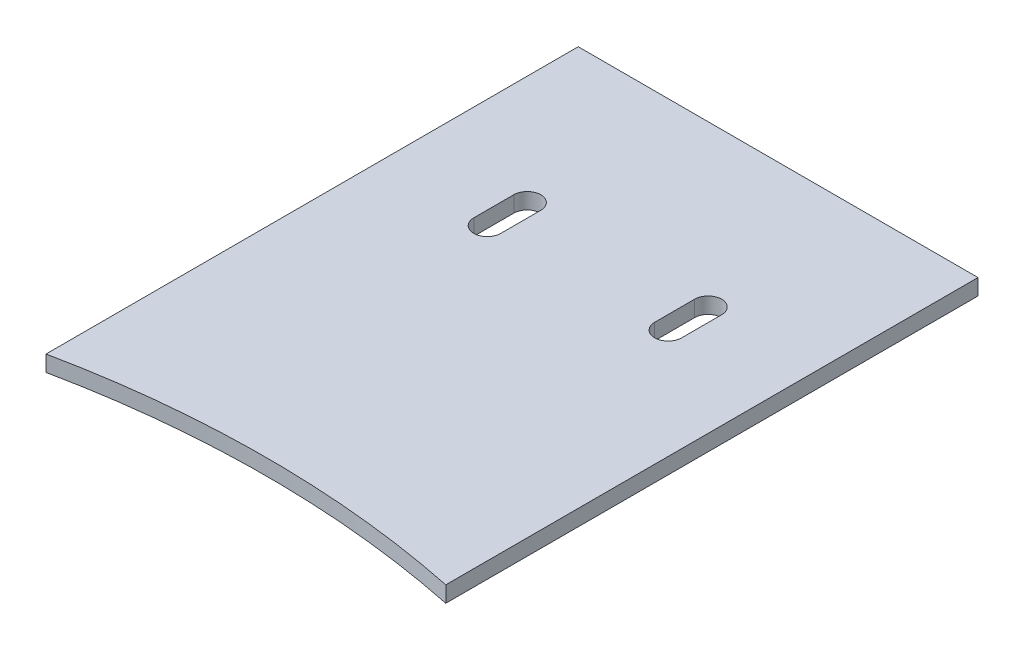
ISO-10303-21;
HEADER;
FILE_DESCRIPTION(('STEP AP214'),'2;1');
FILE_NAME('part.step','',(''),(''),'','','');
FILE_SCHEMA(('AUTOMOTIVE_DESIGN { 1 0 10303 214 1 1 1 1 }'));
ENDSEC;
DATA;
#1=APPLICATION_CONTEXT('core data for automotive mechanical design processes');
#2=APPLICATION_PROTOCOL_DEFINITION('international standard','automotive_design',2000,#1);
#3=PRODUCT_CONTEXT('',#1,'mechanical');
#4=PRODUCT('Part','Part','',(#3));
#5=PRODUCT_RELATED_PRODUCT_CATEGORY('part','',(#4));
#6=PRODUCT_DEFINITION_FORMATION('','',#4);
#7=PRODUCT_DEFINITION_CONTEXT('part definition',#1,'design');
#8=PRODUCT_DEFINITION('design','',#6,#7);
#9=PRODUCT_DEFINITION_SHAPE('','',#8);
#10=(LENGTH_UNIT() NAMED_UNIT(*) SI_UNIT(.MILLI.,.METRE.));
#11=(NAMED_UNIT(*) PLANE_ANGLE_UNIT() SI_UNIT($,.RADIAN.));
#12=(NAMED_UNIT(*) SI_UNIT($,.STERADIAN.) SOLID_ANGLE_UNIT());
#13=UNCERTAINTY_MEASURE_WITH_UNIT(LENGTH_MEASURE(1.E-05),#10,'distance_accuracy_value','');
#14=(GEOMETRIC_REPRESENTATION_CONTEXT(3) GLOBAL_UNCERTAINTY_ASSIGNED_CONTEXT((#13)) GLOBAL_UNIT_ASSIGNED_CONTEXT((#10,
#11,#12)) REPRESENTATION_CONTEXT('',''));
#15=CARTESIAN_POINT('',(0.,0.,0.));
#16=DIRECTION('',(0.,0.,1.));
#17=DIRECTION('',(1.,0.,0.));
#18=AXIS2_PLACEMENT_3D('',#15,#16,#17);
#19=CARTESIAN_POINT('',(0.,16.,-3.5527136788005E-12));
#20=DIRECTION('',(0.,-1.,0.));
#21=DIRECTION('',(0.,0.,-1.));
#22=AXIS2_PLACEMENT_3D('',#19,#20,#21);
#23=PLANE('',#22);
#24=CARTESIAN_POINT('',(-90.5,16.,-1337.));
#25=DIRECTION('',(0.,1.,0.));
#26=DIRECTION('',(0.,0.,1.));
#27=AXIS2_PLACEMENT_3D('',#24,#25,#26);
#28=CIRCLE('',#27,13.5);
#29=CARTESIAN_POINT('',(-77.,16.,-1337.));
#30=VERTEX_POINT('',#29);
#31=CARTESIAN_POINT('',(-104.,16.,-1337.));
#32=VERTEX_POINT('',#31);
#33=EDGE_CURVE('E161',#30,#32,#28,.T.);
#34=ORIENTED_EDGE('',*,*,#33,.F.);
#35=DIRECTION('',(0.,0.,-1.));
#36=VECTOR('',#35,1.);
#37=CARTESIAN_POINT('',(-77.,16.,-1337.));
#38=LINE('',#37,#36);
#39=CARTESIAN_POINT('',(-77.,16.,-1297.));
#40=VERTEX_POINT('',#39);
#41=EDGE_CURVE('E169',#40,#30,#38,.T.);
#42=ORIENTED_EDGE('',*,*,#41,.F.);
#43=CARTESIAN_POINT('',(-90.5,16.,-1297.));
#44=DIRECTION('',(0.,1.,0.));
#45=DIRECTION('',(0.,0.,1.));
#46=AXIS2_PLACEMENT_3D('',#43,#44,#45);
#47=CIRCLE('',#46,13.5);
#48=CARTESIAN_POINT('',(-104.,16.,-1297.));
#49=VERTEX_POINT('',#48);
#50=EDGE_CURVE('E166',#49,#40,#47,.T.);
#51=ORIENTED_EDGE('',*,*,#50,.F.);
#52=DIRECTION('',(0.,0.,1.));
#53=VECTOR('',#52,1.);
#54=CARTESIAN_POINT('',(-104.,16.,-1337.));
#55=LINE('',#54,#53);
#56=EDGE_CURVE('E163',#32,#49,#55,.T.);
#57=ORIENTED_EDGE('',*,*,#56,.F.);
#58=EDGE_LOOP('',(#34,#42,#51,#57));
#59=FACE_BOUND('',#58,.T.);
#60=DIRECTION('',(-1.,0.,0.));
#61=VECTOR('',#60,1.);
#62=CARTESIAN_POINT('',(-200.,16.,-1497.5));
#63=LINE('',#62,#61);
#64=CARTESIAN_POINT('',(200.,16.,-1497.5));
#65=VERTEX_POINT('',#64);
#66=CARTESIAN_POINT('',(-200.,16.,-1497.5));
#67=VERTEX_POINT('',#66);
#68=EDGE_CURVE('E192',#65,#67,#63,.T.);
#69=ORIENTED_EDGE('',*,*,#68,.T.);
#70=DIRECTION('',(0.,0.,1.));
#71=VECTOR('',#70,1.);
#72=CARTESIAN_POINT('',(-200.,16.,-964.99235748269));
#73=LINE('',#72,#71);
#74=CARTESIAN_POINT('',(-200.,16.,-964.99235748269));
#75=VERTEX_POINT('',#74);
#76=EDGE_CURVE('E195',#67,#75,#73,.T.);
#77=ORIENTED_EDGE('',*,*,#76,.T.);
#78=CARTESIAN_POINT('',(0.,16.,-3.5527136788005E-12));
#79=DIRECTION('',(0.,-1.,0.));
#80=DIRECTION('',(0.,0.,-1.));
#81=AXIS2_PLACEMENT_3D('',#78,#79,#80);
#82=CIRCLE('',#81,985.499999999996);
#83=CARTESIAN_POINT('',(200.,16.,-964.99235748269));
#84=VERTEX_POINT('',#83);
#85=EDGE_CURVE('E198',#75,#84,#82,.T.);
#86=ORIENTED_EDGE('',*,*,#85,.T.);
#87=DIRECTION('',(0.,0.,-1.));
#88=VECTOR('',#87,1.);
#89=CARTESIAN_POINT('',(200.,16.,-1497.5));
#90=LINE('',#89,#88);
#91=EDGE_CURVE('E200',#84,#65,#90,.T.);
#92=ORIENTED_EDGE('',*,*,#91,.T.);
#93=EDGE_LOOP('',(#69,#77,#86,#92));
#94=FACE_BOUND('',#93,.T.);
#95=CARTESIAN_POINT('',(90.5,16.,-1297.));
#96=DIRECTION('',(0.,1.,0.));
#97=DIRECTION('',(0.,0.,1.));
#98=AXIS2_PLACEMENT_3D('',#95,#96,#97);
#99=CIRCLE('',#98,13.5);
#100=CARTESIAN_POINT('',(77.,16.,-1297.));
#101=VERTEX_POINT('',#100);
#102=CARTESIAN_POINT('',(104.,16.,-1297.));
#103=VERTEX_POINT('',#102);
#104=EDGE_CURVE('E125',#101,#103,#99,.T.);
#105=ORIENTED_EDGE('',*,*,#104,.F.);
#106=DIRECTION('',(0.,0.,1.));
#107=VECTOR('',#106,1.);
#108=CARTESIAN_POINT('',(77.,16.,-1297.));
#109=LINE('',#108,#107);
#110=CARTESIAN_POINT('',(77.,16.,-1337.));
#111=VERTEX_POINT('',#110);
#112=EDGE_CURVE('E147',#111,#101,#109,.T.);
#113=ORIENTED_EDGE('',*,*,#112,.F.);
#114=CARTESIAN_POINT('',(90.5,16.,-1337.));
#115=DIRECTION('',(0.,1.,0.));
#116=DIRECTION('',(0.,0.,1.));
#117=AXIS2_PLACEMENT_3D('',#114,#115,#116);
#118=CIRCLE('',#117,13.5);
#119=CARTESIAN_POINT('',(104.,16.,-1337.));
#120=VERTEX_POINT('',#119);
#121=EDGE_CURVE('E145',#120,#111,#118,.T.);
#122=ORIENTED_EDGE('',*,*,#121,.F.);
#123=DIRECTION('',(0.,0.,-1.));
#124=VECTOR('',#123,1.);
#125=CARTESIAN_POINT('',(104.,16.,-1297.));
#126=LINE('',#125,#124);
#127=EDGE_CURVE('E133',#103,#120,#126,.T.);
#128=ORIENTED_EDGE('',*,*,#127,.F.);
#129=EDGE_LOOP('',(#105,#113,#122,#128));
#130=FACE_BOUND('',#129,.T.);
#131=ADVANCED_FACE('F36',(#59,#94,#130),#23,.F.);
#132=CARTESIAN_POINT('',(0.,0.,-3.5527136788005E-12));
#133=DIRECTION('',(0.,-1.,0.));
#134=DIRECTION('',(0.,0.,-1.));
#135=AXIS2_PLACEMENT_3D('',#132,#133,#134);
#136=PLANE('',#135);
#137=DIRECTION('',(-1.,0.,0.));
#138=VECTOR('',#137,1.);
#139=CARTESIAN_POINT('',(-200.,0.,-1497.5));
#140=LINE('',#139,#138);
#141=CARTESIAN_POINT('',(200.,0.,-1497.5));
#142=VERTEX_POINT('',#141);
#143=CARTESIAN_POINT('',(-200.,0.,-1497.5));
#144=VERTEX_POINT('',#143);
#145=EDGE_CURVE('E191',#142,#144,#140,.T.);
#146=ORIENTED_EDGE('',*,*,#145,.F.);
#147=DIRECTION('',(0.,0.,-1.));
#148=VECTOR('',#147,1.);
#149=CARTESIAN_POINT('',(200.,0.,-1497.5));
#150=LINE('',#149,#148);
#151=CARTESIAN_POINT('',(200.,0.,-964.99235748269));
#152=VERTEX_POINT('',#151);
#153=EDGE_CURVE('E196',#152,#142,#150,.T.);
#154=ORIENTED_EDGE('',*,*,#153,.F.);
#155=CARTESIAN_POINT('',(0.,0.,-3.5527136788005E-12));
#156=DIRECTION('',(0.,-1.,0.));
#157=DIRECTION('',(0.,0.,-1.));
#158=AXIS2_PLACEMENT_3D('',#155,#156,#157);
#159=CIRCLE('',#158,985.499999999996);
#160=CARTESIAN_POINT('',(-200.,0.,-964.99235748269));
#161=VERTEX_POINT('',#160);
#162=EDGE_CURVE('E207',#161,#152,#159,.T.);
#163=ORIENTED_EDGE('',*,*,#162,.F.);
#164=DIRECTION('',(0.,0.,1.));
#165=VECTOR('',#164,1.);
#166=CARTESIAN_POINT('',(-200.,0.,-964.99235748269));
#167=LINE('',#166,#165);
#168=EDGE_CURVE('E205',#144,#161,#167,.T.);
#169=ORIENTED_EDGE('',*,*,#168,.F.);
#170=EDGE_LOOP('',(#146,#154,#163,#169));
#171=FACE_BOUND('',#170,.T.);
#172=DIRECTION('',(0.,0.,-1.));
#173=VECTOR('',#172,1.);
#174=CARTESIAN_POINT('',(-77.,0.,-1337.));
#175=LINE('',#174,#173);
#176=CARTESIAN_POINT('',(-77.,0.,-1297.));
#177=VERTEX_POINT('',#176);
#178=CARTESIAN_POINT('',(-77.,0.,-1337.));
#179=VERTEX_POINT('',#178);
#180=EDGE_CURVE('E164',#177,#179,#175,.T.);
#181=ORIENTED_EDGE('',*,*,#180,.T.);
#182=CARTESIAN_POINT('',(-90.5,0.,-1337.));
#183=DIRECTION('',(0.,1.,0.));
#184=DIRECTION('',(0.,0.,1.));
#185=AXIS2_PLACEMENT_3D('',#182,#183,#184);
#186=CIRCLE('',#185,13.5);
#187=CARTESIAN_POINT('',(-104.,0.,-1337.));
#188=VERTEX_POINT('',#187);
#189=EDGE_CURVE('E141',#179,#188,#186,.T.);
#190=ORIENTED_EDGE('',*,*,#189,.T.);
#191=DIRECTION('',(0.,0.,1.));
#192=VECTOR('',#191,1.);
#193=CARTESIAN_POINT('',(-104.,0.,-1337.));
#194=LINE('',#193,#192);
#195=CARTESIAN_POINT('',(-104.,0.,-1297.));
#196=VERTEX_POINT('',#195);
#197=EDGE_CURVE('E174',#188,#196,#194,.T.);
#198=ORIENTED_EDGE('',*,*,#197,.T.);
#199=CARTESIAN_POINT('',(-90.5,0.,-1297.));
#200=DIRECTION('',(0.,1.,0.));
#201=DIRECTION('',(0.,0.,1.));
#202=AXIS2_PLACEMENT_3D('',#199,#200,#201);
#203=CIRCLE('',#202,13.5);
#204=EDGE_CURVE('E177',#196,#177,#203,.T.);
#205=ORIENTED_EDGE('',*,*,#204,.T.);
#206=EDGE_LOOP('',(#181,#190,#198,#205));
#207=FACE_BOUND('',#206,.T.);
#208=DIRECTION('',(0.,0.,1.));
#209=VECTOR('',#208,1.);
#210=CARTESIAN_POINT('',(77.,0.,-1297.));
#211=LINE('',#210,#209);
#212=CARTESIAN_POINT('',(77.,0.,-1337.));
#213=VERTEX_POINT('',#212);
#214=CARTESIAN_POINT('',(77.,0.,-1297.));
#215=VERTEX_POINT('',#214);
#216=EDGE_CURVE('E134',#213,#215,#211,.T.);
#217=ORIENTED_EDGE('',*,*,#216,.T.);
#218=CARTESIAN_POINT('',(90.5,0.,-1297.));
#219=DIRECTION('',(0.,1.,0.));
#220=DIRECTION('',(0.,0.,1.));
#221=AXIS2_PLACEMENT_3D('',#218,#219,#220);
#222=CIRCLE('',#221,13.5);
#223=CARTESIAN_POINT('',(104.,0.,-1297.));
#224=VERTEX_POINT('',#223);
#225=EDGE_CURVE('E59',#215,#224,#222,.T.);
#226=ORIENTED_EDGE('',*,*,#225,.T.);
#227=DIRECTION('',(0.,0.,-1.));
#228=VECTOR('',#227,1.);
#229=CARTESIAN_POINT('',(104.,0.,-1297.));
#230=LINE('',#229,#228);
#231=CARTESIAN_POINT('',(104.,0.,-1337.));
#232=VERTEX_POINT('',#231);
#233=EDGE_CURVE('E140',#224,#232,#230,.T.);
#234=ORIENTED_EDGE('',*,*,#233,.T.);
#235=CARTESIAN_POINT('',(90.5,0.,-1337.));
#236=DIRECTION('',(0.,1.,0.));
#237=DIRECTION('',(0.,0.,1.));
#238=AXIS2_PLACEMENT_3D('',#235,#236,#237);
#239=CIRCLE('',#238,13.5);
#240=EDGE_CURVE('E153',#232,#213,#239,.T.);
#241=ORIENTED_EDGE('',*,*,#240,.T.);
#242=EDGE_LOOP('',(#217,#226,#234,#241));
#243=FACE_BOUND('',#242,.T.);
#244=ADVANCED_FACE('F225',(#171,#207,#243),#136,.T.);
#245=CARTESIAN_POINT('',(-200.,16.,-1497.5));
#246=DIRECTION('',(0.,0.,1.));
#247=DIRECTION('',(1.,0.,0.));
#248=AXIS2_PLACEMENT_3D('',#245,#246,#247);
#249=PLANE('',#248);
#250=ORIENTED_EDGE('',*,*,#145,.T.);
#251=DIRECTION('',(0.,-1.,0.));
#252=VECTOR('',#251,1.);
#253=CARTESIAN_POINT('',(-200.,16.,-1497.5));
#254=LINE('',#253,#252);
#255=EDGE_CURVE('E11',#67,#144,#254,.T.);
#256=ORIENTED_EDGE('',*,*,#255,.F.);
#257=ORIENTED_EDGE('',*,*,#68,.F.);
#258=DIRECTION('',(0.,-1.,0.));
#259=VECTOR('',#258,1.);
#260=CARTESIAN_POINT('',(200.,16.,-1497.5));
#261=LINE('',#260,#259);
#262=EDGE_CURVE('E202',#65,#142,#261,.T.);
#263=ORIENTED_EDGE('',*,*,#262,.T.);
#264=EDGE_LOOP('',(#250,#256,#257,#263));
#265=FACE_BOUND('',#264,.T.);
#266=ADVANCED_FACE('F38',(#265),#249,.F.);
#267=CARTESIAN_POINT('',(-200.,16.,-964.99235748269));
#268=DIRECTION('',(1.,0.,0.));
#269=DIRECTION('',(0.,0.,-1.));
#270=AXIS2_PLACEMENT_3D('',#267,#268,#269);
#271=PLANE('',#270);
#272=ORIENTED_EDGE('',*,*,#168,.T.);
#273=DIRECTION('',(0.,-1.,0.));
#274=VECTOR('',#273,1.);
#275=CARTESIAN_POINT('',(-200.,16.,-964.99235748269));
#276=LINE('',#275,#274);
#277=EDGE_CURVE('E44',#75,#161,#276,.T.);
#278=ORIENTED_EDGE('',*,*,#277,.F.);
#279=ORIENTED_EDGE('',*,*,#76,.F.);
#280=ORIENTED_EDGE('',*,*,#255,.T.);
#281=EDGE_LOOP('',(#272,#278,#279,#280));
#282=FACE_BOUND('',#281,.T.);
#283=ADVANCED_FACE('F235',(#282),#271,.F.);
#284=CARTESIAN_POINT('',(0.,16.,-3.5527136788005E-12));
#285=DIRECTION('',(0.,-1.,0.));
#286=DIRECTION('',(0.,0.,-1.));
#287=AXIS2_PLACEMENT_3D('',#284,#285,#286);
#288=CYLINDRICAL_SURFACE('',#287,985.499999999996);
#289=ORIENTED_EDGE('',*,*,#162,.T.);
#290=DIRECTION('',(0.,-1.,0.));
#291=VECTOR('',#290,1.);
#292=CARTESIAN_POINT('',(200.,16.,-964.99235748269));
#293=LINE('',#292,#291);
#294=EDGE_CURVE('E212',#84,#152,#293,.T.);
#295=ORIENTED_EDGE('',*,*,#294,.F.);
#296=ORIENTED_EDGE('',*,*,#85,.F.);
#297=ORIENTED_EDGE('',*,*,#277,.T.);
#298=EDGE_LOOP('',(#289,#295,#296,#297));
#299=FACE_BOUND('',#298,.T.);
#300=ADVANCED_FACE('F219',(#299),#288,.F.);
#301=CARTESIAN_POINT('',(200.,16.,-1497.5));
#302=DIRECTION('',(-1.,0.,0.));
#303=DIRECTION('',(0.,0.,1.));
#304=AXIS2_PLACEMENT_3D('',#301,#302,#303);
#305=PLANE('',#304);
#306=ORIENTED_EDGE('',*,*,#153,.T.);
#307=ORIENTED_EDGE('',*,*,#262,.F.);
#308=ORIENTED_EDGE('',*,*,#91,.F.);
#309=ORIENTED_EDGE('',*,*,#294,.T.);
#310=EDGE_LOOP('',(#306,#307,#308,#309));
#311=FACE_BOUND('',#310,.T.);
#312=ADVANCED_FACE('F229',(#311),#305,.F.);
#313=CARTESIAN_POINT('',(-90.5,16.,-1337.));
#314=DIRECTION('',(0.,-1.,0.));
#315=DIRECTION('',(0.,0.,-1.));
#316=AXIS2_PLACEMENT_3D('',#313,#314,#315);
#317=CYLINDRICAL_SURFACE('',#316,13.5);
#318=ORIENTED_EDGE('',*,*,#189,.F.);
#319=DIRECTION('',(0.,-1.,0.));
#320=VECTOR('',#319,1.);
#321=CARTESIAN_POINT('',(-77.,16.,-1337.));
#322=LINE('',#321,#320);
#323=EDGE_CURVE('E171',#30,#179,#322,.T.);
#324=ORIENTED_EDGE('',*,*,#323,.F.);
#325=ORIENTED_EDGE('',*,*,#33,.T.);
#326=DIRECTION('',(0.,-1.,0.));
#327=VECTOR('',#326,1.);
#328=CARTESIAN_POINT('',(-104.,16.,-1337.));
#329=LINE('',#328,#327);
#330=EDGE_CURVE('E188',#32,#188,#329,.T.);
#331=ORIENTED_EDGE('',*,*,#330,.T.);
#332=EDGE_LOOP('',(#318,#324,#325,#331));
#333=FACE_BOUND('',#332,.T.);
#334=ADVANCED_FACE('F251',(#333),#317,.F.);
#335=CARTESIAN_POINT('',(-104.,16.,-1337.));
#336=DIRECTION('',(1.,0.,0.));
#337=DIRECTION('',(0.,0.,-1.));
#338=AXIS2_PLACEMENT_3D('',#335,#336,#337);
#339=PLANE('',#338);
#340=ORIENTED_EDGE('',*,*,#197,.F.);
#341=ORIENTED_EDGE('',*,*,#330,.F.);
#342=ORIENTED_EDGE('',*,*,#56,.T.);
#343=DIRECTION('',(0.,-1.,0.));
#344=VECTOR('',#343,1.);
#345=CARTESIAN_POINT('',(-104.,16.,-1297.));
#346=LINE('',#345,#344);
#347=EDGE_CURVE('E186',#49,#196,#346,.T.);
#348=ORIENTED_EDGE('',*,*,#347,.T.);
#349=EDGE_LOOP('',(#340,#341,#342,#348));
#350=FACE_BOUND('',#349,.T.);
#351=ADVANCED_FACE('F258',(#350),#339,.T.);
#352=CARTESIAN_POINT('',(-90.5,16.,-1297.));
#353=DIRECTION('',(0.,-1.,0.));
#354=DIRECTION('',(0.,0.,-1.));
#355=AXIS2_PLACEMENT_3D('',#352,#353,#354);
#356=CYLINDRICAL_SURFACE('',#355,13.5);
#357=ORIENTED_EDGE('',*,*,#204,.F.);
#358=ORIENTED_EDGE('',*,*,#347,.F.);
#359=ORIENTED_EDGE('',*,*,#50,.T.);
#360=DIRECTION('',(0.,-1.,0.));
#361=VECTOR('',#360,1.);
#362=CARTESIAN_POINT('',(-77.,16.,-1297.));
#363=LINE('',#362,#361);
#364=EDGE_CURVE('E184',#40,#177,#363,.T.);
#365=ORIENTED_EDGE('',*,*,#364,.T.);
#366=EDGE_LOOP('',(#357,#358,#359,#365));
#367=FACE_BOUND('',#366,.T.);
#368=ADVANCED_FACE('F263',(#367),#356,.F.);
#369=CARTESIAN_POINT('',(-77.,16.,-1337.));
#370=DIRECTION('',(-1.,0.,0.));
#371=DIRECTION('',(0.,0.,1.));
#372=AXIS2_PLACEMENT_3D('',#369,#370,#371);
#373=PLANE('',#372);
#374=ORIENTED_EDGE('',*,*,#180,.F.);
#375=ORIENTED_EDGE('',*,*,#364,.F.);
#376=ORIENTED_EDGE('',*,*,#41,.T.);
#377=ORIENTED_EDGE('',*,*,#323,.T.);
#378=EDGE_LOOP('',(#374,#375,#376,#377));
#379=FACE_BOUND('',#378,.T.);
#380=ADVANCED_FACE('F269',(#379),#373,.T.);
#381=CARTESIAN_POINT('',(90.5,16.,-1297.));
#382=DIRECTION('',(0.,-1.,0.));
#383=DIRECTION('',(0.,0.,-1.));
#384=AXIS2_PLACEMENT_3D('',#381,#382,#383);
#385=CYLINDRICAL_SURFACE('',#384,13.5);
#386=ORIENTED_EDGE('',*,*,#225,.F.);
#387=DIRECTION('',(0.,-1.,0.));
#388=VECTOR('',#387,1.);
#389=CARTESIAN_POINT('',(77.,16.,-1297.));
#390=LINE('',#389,#388);
#391=EDGE_CURVE('E129',#101,#215,#390,.T.);
#392=ORIENTED_EDGE('',*,*,#391,.F.);
#393=ORIENTED_EDGE('',*,*,#104,.T.);
#394=DIRECTION('',(0.,-1.,0.));
#395=VECTOR('',#394,1.);
#396=CARTESIAN_POINT('',(104.,16.,-1297.));
#397=LINE('',#396,#395);
#398=EDGE_CURVE('E128',#103,#224,#397,.T.);
#399=ORIENTED_EDGE('',*,*,#398,.T.);
#400=EDGE_LOOP('',(#386,#392,#393,#399));
#401=FACE_BOUND('',#400,.T.);
#402=ADVANCED_FACE('F127',(#401),#385,.F.);
#403=CARTESIAN_POINT('',(104.,16.,-1297.));
#404=DIRECTION('',(-1.,0.,0.));
#405=DIRECTION('',(0.,0.,1.));
#406=AXIS2_PLACEMENT_3D('',#403,#404,#405);
#407=PLANE('',#406);
#408=ORIENTED_EDGE('',*,*,#233,.F.);
#409=ORIENTED_EDGE('',*,*,#398,.F.);
#410=ORIENTED_EDGE('',*,*,#127,.T.);
#411=DIRECTION('',(0.,-1.,0.));
#412=VECTOR('',#411,1.);
#413=CARTESIAN_POINT('',(104.,16.,-1337.));
#414=LINE('',#413,#412);
#415=EDGE_CURVE('E142',#120,#232,#414,.T.);
#416=ORIENTED_EDGE('',*,*,#415,.T.);
#417=EDGE_LOOP('',(#408,#409,#410,#416));
#418=FACE_BOUND('',#417,.T.);
#419=ADVANCED_FACE('F137',(#418),#407,.T.);
#420=CARTESIAN_POINT('',(90.5,16.,-1337.));
#421=DIRECTION('',(0.,-1.,0.));
#422=DIRECTION('',(0.,0.,-1.));
#423=AXIS2_PLACEMENT_3D('',#420,#421,#422);
#424=CYLINDRICAL_SURFACE('',#423,13.5);
#425=ORIENTED_EDGE('',*,*,#240,.F.);
#426=ORIENTED_EDGE('',*,*,#415,.F.);
#427=ORIENTED_EDGE('',*,*,#121,.T.);
#428=DIRECTION('',(0.,-1.,0.));
#429=VECTOR('',#428,1.);
#430=CARTESIAN_POINT('',(77.,16.,-1337.));
#431=LINE('',#430,#429);
#432=EDGE_CURVE('E51',#111,#213,#431,.T.);
#433=ORIENTED_EDGE('',*,*,#432,.T.);
#434=EDGE_LOOP('',(#425,#426,#427,#433));
#435=FACE_BOUND('',#434,.T.);
#436=ADVANCED_FACE('F288',(#435),#424,.F.);
#437=CARTESIAN_POINT('',(77.,16.,-1297.));
#438=DIRECTION('',(1.,0.,0.));
#439=DIRECTION('',(0.,0.,-1.));
#440=AXIS2_PLACEMENT_3D('',#437,#438,#439);
#441=PLANE('',#440);
#442=ORIENTED_EDGE('',*,*,#216,.F.);
#443=ORIENTED_EDGE('',*,*,#432,.F.);
#444=ORIENTED_EDGE('',*,*,#112,.T.);
#445=ORIENTED_EDGE('',*,*,#391,.T.);
#446=EDGE_LOOP('',(#442,#443,#444,#445));
#447=FACE_BOUND('',#446,.T.);
#448=ADVANCED_FACE('F291',(#447),#441,.T.);
#449=CLOSED_SHELL('',(#131,#244,#266,#283,#300,#312,#334,#351,#368,#380,#402,#419,#436,#448));
#450=MANIFOLD_SOLID_BREP('B2',#449);
#451=ADVANCED_BREP_SHAPE_REPRESENTATION('',(#18,#450),#14);
#452=SHAPE_DEFINITION_REPRESENTATION(#9,#451);
ENDSEC;
END-ISO-10303-21;
